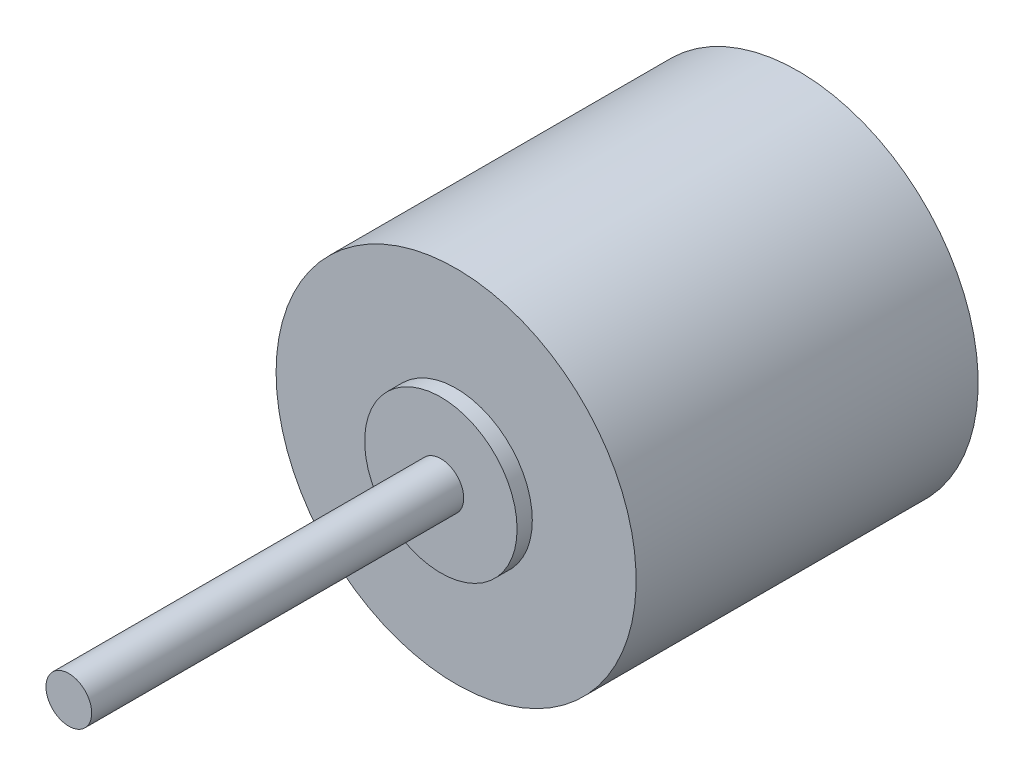
ISO-10303-21;
HEADER;
FILE_DESCRIPTION(('STEP AP214'),'2;1');
FILE_NAME('part.step','',(''),(''),'','','');
FILE_SCHEMA(('AUTOMOTIVE_DESIGN { 1 0 10303 214 1 1 1 1 }'));
ENDSEC;
DATA;
#1=APPLICATION_CONTEXT('core data for automotive mechanical design processes');
#2=APPLICATION_PROTOCOL_DEFINITION('international standard','automotive_design',2000,#1);
#3=PRODUCT_CONTEXT('',#1,'mechanical');
#4=PRODUCT('Part','Part','',(#3));
#5=PRODUCT_RELATED_PRODUCT_CATEGORY('part','',(#4));
#6=PRODUCT_DEFINITION_FORMATION('','',#4);
#7=PRODUCT_DEFINITION_CONTEXT('part definition',#1,'design');
#8=PRODUCT_DEFINITION('design','',#6,#7);
#9=PRODUCT_DEFINITION_SHAPE('','',#8);
#10=(LENGTH_UNIT() NAMED_UNIT(*) SI_UNIT(.MILLI.,.METRE.));
#11=(NAMED_UNIT(*) PLANE_ANGLE_UNIT() SI_UNIT($,.RADIAN.));
#12=(NAMED_UNIT(*) SI_UNIT($,.STERADIAN.) SOLID_ANGLE_UNIT());
#13=UNCERTAINTY_MEASURE_WITH_UNIT(LENGTH_MEASURE(1.E-05),#10,'distance_accuracy_value','');
#14=(GEOMETRIC_REPRESENTATION_CONTEXT(3) GLOBAL_UNCERTAINTY_ASSIGNED_CONTEXT((#13)) GLOBAL_UNIT_ASSIGNED_CONTEXT((#10,
#11,#12)) REPRESENTATION_CONTEXT('',''));
#15=CARTESIAN_POINT('',(0.,0.,0.));
#16=DIRECTION('',(0.,0.,1.));
#17=DIRECTION('',(1.,0.,0.));
#18=AXIS2_PLACEMENT_3D('',#15,#16,#17);
#19=CARTESIAN_POINT('',(0.,0.,57.));
#20=DIRECTION('',(0.,0.,-1.));
#21=DIRECTION('',(-1.,0.,0.));
#22=AXIS2_PLACEMENT_3D('',#19,#20,#21);
#23=CYLINDRICAL_SURFACE('',#22,30.);
#24=CARTESIAN_POINT('',(0.,0.,57.));
#25=DIRECTION('',(0.,0.,1.));
#26=DIRECTION('',(1.,0.,0.));
#27=AXIS2_PLACEMENT_3D('',#24,#25,#26);
#28=CIRCLE('',#27,30.);
#29=CARTESIAN_POINT('',(-30.,0.,57.));
#30=VERTEX_POINT('',#29);
#31=EDGE_CURVE('E53',#30,#30,#28,.T.);
#32=CARTESIAN_POINT('',(0.,0.,0.));
#33=DIRECTION('',(0.,0.,1.));
#34=DIRECTION('',(1.,0.,0.));
#35=AXIS2_PLACEMENT_3D('',#32,#33,#34);
#36=CIRCLE('',#35,30.);
#37=CARTESIAN_POINT('',(-30.,0.,0.));
#38=VERTEX_POINT('',#37);
#39=EDGE_CURVE('E42',#38,#38,#36,.T.);
#40=CARTESIAN_POINT('',(-30.,0.,57.));
#41=CARTESIAN_POINT('',(-30.,0.,56.40625));
#42=CARTESIAN_POINT('',(-30.,0.,55.8125));
#43=CARTESIAN_POINT('',(-30.,0.,54.625));
#44=CARTESIAN_POINT('',(-30.,0.,54.03125));
#45=CARTESIAN_POINT('',(-30.,0.,52.84375));
#46=CARTESIAN_POINT('',(-30.,0.,52.25));
#47=CARTESIAN_POINT('',(-30.,0.,51.0625));
#48=CARTESIAN_POINT('',(-30.,0.,50.46875));
#49=CARTESIAN_POINT('',(-30.,0.,49.28125));
#50=CARTESIAN_POINT('',(-30.,0.,48.6875));
#51=CARTESIAN_POINT('',(-30.,0.,47.5));
#52=CARTESIAN_POINT('',(-30.,0.,46.90625));
#53=CARTESIAN_POINT('',(-30.,0.,45.71875));
#54=CARTESIAN_POINT('',(-30.,0.,45.125));
#55=CARTESIAN_POINT('',(-30.,0.,43.9375));
#56=CARTESIAN_POINT('',(-30.,0.,43.34375));
#57=CARTESIAN_POINT('',(-30.,0.,42.15625));
#58=CARTESIAN_POINT('',(-30.,0.,41.5625));
#59=CARTESIAN_POINT('',(-30.,0.,40.375));
#60=CARTESIAN_POINT('',(-30.,0.,39.78125));
#61=CARTESIAN_POINT('',(-30.,0.,38.59375));
#62=CARTESIAN_POINT('',(-30.,0.,38.));
#63=CARTESIAN_POINT('',(-30.,0.,36.8125));
#64=CARTESIAN_POINT('',(-30.,0.,36.21875));
#65=CARTESIAN_POINT('',(-30.,0.,35.03125));
#66=CARTESIAN_POINT('',(-30.,0.,34.4375));
#67=CARTESIAN_POINT('',(-30.,0.,33.25));
#68=CARTESIAN_POINT('',(-30.,0.,32.65625));
#69=CARTESIAN_POINT('',(-30.,0.,31.46875));
#70=CARTESIAN_POINT('',(-30.,0.,30.875));
#71=CARTESIAN_POINT('',(-30.,0.,29.6875));
#72=CARTESIAN_POINT('',(-30.,0.,29.09375));
#73=CARTESIAN_POINT('',(-30.,0.,27.90625));
#74=CARTESIAN_POINT('',(-30.,0.,27.3125));
#75=CARTESIAN_POINT('',(-30.,0.,26.125));
#76=CARTESIAN_POINT('',(-30.,0.,25.53125));
#77=CARTESIAN_POINT('',(-30.,0.,24.34375));
#78=CARTESIAN_POINT('',(-30.,0.,23.75));
#79=CARTESIAN_POINT('',(-30.,0.,22.5625));
#80=CARTESIAN_POINT('',(-30.,0.,21.96875));
#81=CARTESIAN_POINT('',(-30.,0.,20.78125));
#82=CARTESIAN_POINT('',(-30.,0.,20.1875));
#83=CARTESIAN_POINT('',(-30.,0.,19.));
#84=CARTESIAN_POINT('',(-30.,0.,18.40625));
#85=CARTESIAN_POINT('',(-30.,0.,17.21875));
#86=CARTESIAN_POINT('',(-30.,0.,16.625));
#87=CARTESIAN_POINT('',(-30.,0.,15.4375));
#88=CARTESIAN_POINT('',(-30.,0.,14.84375));
#89=CARTESIAN_POINT('',(-30.,0.,13.65625));
#90=CARTESIAN_POINT('',(-30.,0.,13.0625));
#91=CARTESIAN_POINT('',(-30.,0.,11.875));
#92=CARTESIAN_POINT('',(-30.,0.,11.28125));
#93=CARTESIAN_POINT('',(-30.,0.,10.09375));
#94=CARTESIAN_POINT('',(-30.,0.,9.5));
#95=CARTESIAN_POINT('',(-30.,0.,8.3125));
#96=CARTESIAN_POINT('',(-30.,0.,7.71875));
#97=CARTESIAN_POINT('',(-30.,0.,6.53125));
#98=CARTESIAN_POINT('',(-30.,0.,5.9375));
#99=CARTESIAN_POINT('',(-30.,0.,4.75));
#100=CARTESIAN_POINT('',(-30.,0.,4.15625));
#101=CARTESIAN_POINT('',(-30.,0.,2.96875));
#102=CARTESIAN_POINT('',(-30.,0.,2.375));
#103=CARTESIAN_POINT('',(-30.,0.,1.1875));
#104=CARTESIAN_POINT('',(-30.,0.,0.593749999999999));
#105=CARTESIAN_POINT('',(-30.,0.,0.));
#106=B_SPLINE_CURVE_WITH_KNOTS('',3,(#40,#41,#42,#43,#44,#45,#46,#47,#48,#49,#50,#51,#52,#53,
#54,#55,#56,#57,#58,#59,#60,#61,#62,#63,#64,#65,#66,#67,#68,#69,#70,#71,#72,#73,#74,#75,#76,#77,
#78,#79,#80,#81,#82,#83,#84,#85,#86,#87,#88,#89,#90,#91,#92,#93,#94,#95,#96,#97,#98,#99,#100,
#101,#102,#103,#104,#105),.UNSPECIFIED.,.F.,.F.,(4,2,2,2,2,2,2,2,2,2,2,2,2,2,2,2,2,2,2,2,2,2,2,
2,2,2,2,2,2,2,2,2,4),(0.,1.78125,3.5625,5.34374999999999,7.12499999999999,8.90625,10.6875,
12.46875,14.25,16.03125,17.8125,19.59375,21.375,23.15625,24.9375,26.71875,28.5,30.28125,32.0625,
33.84375,35.625,37.40625,39.1875,40.96875,42.75,44.53125,46.3125,48.09375,49.875,51.65625,
53.4375,55.21875,57.),.UNSPECIFIED.);
#107=EDGE_CURVE('BSEAM39',#30,#38,#106,.T.);
#108=ORIENTED_EDGE('',*,*,#31,.F.);
#109=ORIENTED_EDGE('',*,*,#39,.T.);
#110=ORIENTED_EDGE('',*,*,#107,.T.);
#111=ORIENTED_EDGE('',*,*,#107,.F.);
#112=EDGE_LOOP('',(#108,#110,#109,#111));
#113=FACE_BOUND('',#112,.T.);
#114=ADVANCED_FACE('F39',(#113),#23,.T.);
#115=CARTESIAN_POINT('',(0.,0.,57.));
#116=DIRECTION('',(0.,0.,1.));
#117=DIRECTION('',(1.,0.,0.));
#118=AXIS2_PLACEMENT_3D('',#115,#116,#117);
#119=PLANE('',#118);
#120=CARTESIAN_POINT('',(0.,0.,57.));
#121=DIRECTION('',(0.,0.,1.));
#122=DIRECTION('',(1.,0.,0.));
#123=AXIS2_PLACEMENT_3D('',#120,#121,#122);
#124=CIRCLE('',#123,12.7);
#125=CARTESIAN_POINT('',(12.7,0.,57.));
#126=VERTEX_POINT('',#125);
#127=EDGE_CURVE('E47',#126,#126,#124,.T.);
#128=ORIENTED_EDGE('',*,*,#127,.F.);
#129=EDGE_LOOP('',(#128));
#130=FACE_BOUND('',#129,.T.);
#131=ORIENTED_EDGE('',*,*,#31,.T.);
#132=EDGE_LOOP('',(#131));
#133=FACE_BOUND('',#132,.T.);
#134=ADVANCED_FACE('F74',(#130,#133),#119,.T.);
#135=CARTESIAN_POINT('',(0.,0.,0.));
#136=DIRECTION('',(0.,0.,1.));
#137=DIRECTION('',(1.,0.,0.));
#138=AXIS2_PLACEMENT_3D('',#135,#136,#137);
#139=PLANE('',#138);
#140=CARTESIAN_POINT('',(-16.,0.,0.));
#141=DIRECTION('',(0.,0.,-1.));
#142=DIRECTION('',(-1.,0.,0.));
#143=AXIS2_PLACEMENT_3D('',#140,#141,#142);
#144=CIRCLE('',#143,2.);
#145=CARTESIAN_POINT('',(-18.,0.,0.));
#146=VERTEX_POINT('',#145);
#147=EDGE_CURVE('E222',#146,#146,#144,.T.);
#148=ORIENTED_EDGE('',*,*,#147,.F.);
#149=EDGE_LOOP('',(#148));
#150=FACE_BOUND('',#149,.T.);
#151=CARTESIAN_POINT('',(0.,16.,0.));
#152=DIRECTION('',(0.,0.,-1.));
#153=DIRECTION('',(-1.,0.,0.));
#154=AXIS2_PLACEMENT_3D('',#151,#152,#153);
#155=CIRCLE('',#154,2.);
#156=CARTESIAN_POINT('',(-2.,16.,0.));
#157=VERTEX_POINT('',#156);
#158=EDGE_CURVE('E228',#157,#157,#155,.T.);
#159=ORIENTED_EDGE('',*,*,#158,.F.);
#160=EDGE_LOOP('',(#159));
#161=FACE_BOUND('',#160,.T.);
#162=CARTESIAN_POINT('',(16.,0.,0.));
#163=DIRECTION('',(0.,0.,-1.));
#164=DIRECTION('',(-1.,0.,0.));
#165=AXIS2_PLACEMENT_3D('',#162,#163,#164);
#166=CIRCLE('',#165,2.);
#167=CARTESIAN_POINT('',(14.,0.,0.));
#168=VERTEX_POINT('',#167);
#169=EDGE_CURVE('E238',#168,#168,#166,.T.);
#170=ORIENTED_EDGE('',*,*,#169,.F.);
#171=EDGE_LOOP('',(#170));
#172=FACE_BOUND('',#171,.T.);
#173=CARTESIAN_POINT('',(0.,-16.,0.));
#174=DIRECTION('',(0.,0.,-1.));
#175=DIRECTION('',(-1.,0.,0.));
#176=AXIS2_PLACEMENT_3D('',#173,#174,#175);
#177=CIRCLE('',#176,2.);
#178=CARTESIAN_POINT('',(-2.,-16.,0.));
#179=VERTEX_POINT('',#178);
#180=EDGE_CURVE('E246',#179,#179,#177,.T.);
#181=ORIENTED_EDGE('',*,*,#180,.F.);
#182=EDGE_LOOP('',(#181));
#183=FACE_BOUND('',#182,.T.);
#184=ORIENTED_EDGE('',*,*,#39,.F.);
#185=EDGE_LOOP('',(#184));
#186=FACE_BOUND('',#185,.T.);
#187=ADVANCED_FACE('F71',(#150,#161,#172,#183,#186),#139,.F.);
#188=CARTESIAN_POINT('',(0.,0.,59.54));
#189=DIRECTION('',(0.,0.,-1.));
#190=DIRECTION('',(-1.,0.,0.));
#191=AXIS2_PLACEMENT_3D('',#188,#189,#190);
#192=CYLINDRICAL_SURFACE('',#191,12.7);
#193=CARTESIAN_POINT('',(0.,0.,59.54));
#194=DIRECTION('',(0.,0.,1.));
#195=DIRECTION('',(1.,0.,0.));
#196=AXIS2_PLACEMENT_3D('',#193,#194,#195);
#197=CIRCLE('',#196,12.7);
#198=CARTESIAN_POINT('',(12.7,0.,59.54));
#199=VERTEX_POINT('',#198);
#200=EDGE_CURVE('E59',#199,#199,#197,.T.);
#201=ORIENTED_EDGE('',*,*,#200,.F.);
#202=EDGE_LOOP('',(#201));
#203=FACE_BOUND('',#202,.T.);
#204=ORIENTED_EDGE('',*,*,#127,.T.);
#205=EDGE_LOOP('',(#204));
#206=FACE_BOUND('',#205,.T.);
#207=ADVANCED_FACE('F73',(#203,#206),#192,.T.);
#208=CARTESIAN_POINT('',(0.,0.,59.54));
#209=DIRECTION('',(0.,0.,1.));
#210=DIRECTION('',(1.,0.,0.));
#211=AXIS2_PLACEMENT_3D('',#208,#209,#210);
#212=PLANE('',#211);
#213=CARTESIAN_POINT('',(0.,0.,59.54));
#214=DIRECTION('',(0.,0.,1.));
#215=DIRECTION('',(1.,0.,0.));
#216=AXIS2_PLACEMENT_3D('',#213,#214,#215);
#217=CIRCLE('',#216,3.81);
#218=CARTESIAN_POINT('',(3.81,0.,59.54));
#219=VERTEX_POINT('',#218);
#220=EDGE_CURVE('E10',#219,#219,#217,.T.);
#221=ORIENTED_EDGE('',*,*,#220,.F.);
#222=EDGE_LOOP('',(#221));
#223=FACE_BOUND('',#222,.T.);
#224=ORIENTED_EDGE('',*,*,#200,.T.);
#225=EDGE_LOOP('',(#224));
#226=FACE_BOUND('',#225,.T.);
#227=ADVANCED_FACE('F80',(#223,#226),#212,.T.);
#228=CARTESIAN_POINT('',(0.,0.,121.54));
#229=DIRECTION('',(0.,0.,-1.));
#230=DIRECTION('',(-1.,0.,0.));
#231=AXIS2_PLACEMENT_3D('',#228,#229,#230);
#232=CYLINDRICAL_SURFACE('',#231,3.81);
#233=CARTESIAN_POINT('',(0.,0.,121.54));
#234=DIRECTION('',(0.,0.,1.));
#235=DIRECTION('',(1.,0.,0.));
#236=AXIS2_PLACEMENT_3D('',#233,#234,#235);
#237=CIRCLE('',#236,3.81);
#238=CARTESIAN_POINT('',(3.81,0.,121.54));
#239=VERTEX_POINT('',#238);
#240=EDGE_CURVE('E57',#239,#239,#237,.T.);
#241=ORIENTED_EDGE('',*,*,#240,.F.);
#242=EDGE_LOOP('',(#241));
#243=FACE_BOUND('',#242,.T.);
#244=ORIENTED_EDGE('',*,*,#220,.T.);
#245=EDGE_LOOP('',(#244));
#246=FACE_BOUND('',#245,.T.);
#247=ADVANCED_FACE('F111',(#243,#246),#232,.T.);
#248=CARTESIAN_POINT('',(0.,0.,121.54));
#249=DIRECTION('',(0.,0.,1.));
#250=DIRECTION('',(1.,0.,0.));
#251=AXIS2_PLACEMENT_3D('',#248,#249,#250);
#252=PLANE('',#251);
#253=ORIENTED_EDGE('',*,*,#240,.T.);
#254=EDGE_LOOP('',(#253));
#255=FACE_BOUND('',#254,.T.);
#256=ADVANCED_FACE('F121',(#255),#252,.T.);
#257=CARTESIAN_POINT('',(0.,-16.,5.08));
#258=DIRECTION('',(0.,0.,-1.));
#259=DIRECTION('',(-1.,0.,0.));
#260=AXIS2_PLACEMENT_3D('',#257,#258,#259);
#261=CYLINDRICAL_SURFACE('',#260,2.);
#262=CARTESIAN_POINT('',(0.,-16.,5.08));
#263=DIRECTION('',(0.,0.,-1.));
#264=DIRECTION('',(-1.,0.,0.));
#265=AXIS2_PLACEMENT_3D('',#262,#263,#264);
#266=CIRCLE('',#265,2.);
#267=CARTESIAN_POINT('',(-2.,-16.,5.08));
#268=VERTEX_POINT('',#267);
#269=EDGE_CURVE('E249',#268,#268,#266,.T.);
#270=ORIENTED_EDGE('',*,*,#269,.F.);
#271=EDGE_LOOP('',(#270));
#272=FACE_BOUND('',#271,.T.);
#273=ORIENTED_EDGE('',*,*,#180,.T.);
#274=EDGE_LOOP('',(#273));
#275=FACE_BOUND('',#274,.T.);
#276=ADVANCED_FACE('F130',(#272,#275),#261,.F.);
#277=CARTESIAN_POINT('',(0.,-16.,5.08));
#278=DIRECTION('',(0.,0.,-1.));
#279=DIRECTION('',(-1.,0.,0.));
#280=AXIS2_PLACEMENT_3D('',#277,#278,#279);
#281=PLANE('',#280);
#282=ORIENTED_EDGE('',*,*,#269,.T.);
#283=EDGE_LOOP('',(#282));
#284=FACE_BOUND('',#283,.T.);
#285=ADVANCED_FACE('F144',(#284),#281,.T.);
#286=CARTESIAN_POINT('',(16.,0.,5.08));
#287=DIRECTION('',(0.,0.,-1.));
#288=DIRECTION('',(-1.,0.,0.));
#289=AXIS2_PLACEMENT_3D('',#286,#287,#288);
#290=CYLINDRICAL_SURFACE('',#289,2.);
#291=CARTESIAN_POINT('',(16.,0.,5.08));
#292=DIRECTION('',(0.,0.,-1.));
#293=DIRECTION('',(-1.,0.,0.));
#294=AXIS2_PLACEMENT_3D('',#291,#292,#293);
#295=CIRCLE('',#294,2.);
#296=CARTESIAN_POINT('',(14.,0.,5.08));
#297=VERTEX_POINT('',#296);
#298=EDGE_CURVE('E242',#297,#297,#295,.T.);
#299=ORIENTED_EDGE('',*,*,#298,.F.);
#300=EDGE_LOOP('',(#299));
#301=FACE_BOUND('',#300,.T.);
#302=ORIENTED_EDGE('',*,*,#169,.T.);
#303=EDGE_LOOP('',(#302));
#304=FACE_BOUND('',#303,.T.);
#305=ADVANCED_FACE('F154',(#301,#304),#290,.F.);
#306=CARTESIAN_POINT('',(16.,0.,5.08));
#307=DIRECTION('',(0.,0.,-1.));
#308=DIRECTION('',(-1.,0.,0.));
#309=AXIS2_PLACEMENT_3D('',#306,#307,#308);
#310=PLANE('',#309);
#311=ORIENTED_EDGE('',*,*,#298,.T.);
#312=EDGE_LOOP('',(#311));
#313=FACE_BOUND('',#312,.T.);
#314=ADVANCED_FACE('F164',(#313),#310,.T.);
#315=CARTESIAN_POINT('',(0.,16.,5.08));
#316=DIRECTION('',(0.,0.,-1.));
#317=DIRECTION('',(-1.,0.,0.));
#318=AXIS2_PLACEMENT_3D('',#315,#316,#317);
#319=CYLINDRICAL_SURFACE('',#318,2.);
#320=CARTESIAN_POINT('',(0.,16.,5.08));
#321=DIRECTION('',(0.,0.,-1.));
#322=DIRECTION('',(-1.,0.,0.));
#323=AXIS2_PLACEMENT_3D('',#320,#321,#322);
#324=CIRCLE('',#323,2.);
#325=CARTESIAN_POINT('',(-2.,16.,5.08));
#326=VERTEX_POINT('',#325);
#327=EDGE_CURVE('E234',#326,#326,#324,.T.);
#328=ORIENTED_EDGE('',*,*,#327,.F.);
#329=EDGE_LOOP('',(#328));
#330=FACE_BOUND('',#329,.T.);
#331=ORIENTED_EDGE('',*,*,#158,.T.);
#332=EDGE_LOOP('',(#331));
#333=FACE_BOUND('',#332,.T.);
#334=ADVANCED_FACE('F174',(#330,#333),#319,.F.);
#335=CARTESIAN_POINT('',(0.,16.,5.08));
#336=DIRECTION('',(0.,0.,-1.));
#337=DIRECTION('',(-1.,0.,0.));
#338=AXIS2_PLACEMENT_3D('',#335,#336,#337);
#339=PLANE('',#338);
#340=ORIENTED_EDGE('',*,*,#327,.T.);
#341=EDGE_LOOP('',(#340));
#342=FACE_BOUND('',#341,.T.);
#343=ADVANCED_FACE('F184',(#342),#339,.T.);
#344=CARTESIAN_POINT('',(-16.,0.,5.08));
#345=DIRECTION('',(0.,0.,-1.));
#346=DIRECTION('',(-1.,0.,0.));
#347=AXIS2_PLACEMENT_3D('',#344,#345,#346);
#348=CYLINDRICAL_SURFACE('',#347,2.);
#349=CARTESIAN_POINT('',(-16.,0.,5.08));
#350=DIRECTION('',(0.,0.,-1.));
#351=DIRECTION('',(-1.,0.,0.));
#352=AXIS2_PLACEMENT_3D('',#349,#350,#351);
#353=CIRCLE('',#352,2.);
#354=CARTESIAN_POINT('',(-18.,0.,5.08));
#355=VERTEX_POINT('',#354);
#356=EDGE_CURVE('E220',#355,#355,#353,.T.);
#357=ORIENTED_EDGE('',*,*,#356,.F.);
#358=EDGE_LOOP('',(#357));
#359=FACE_BOUND('',#358,.T.);
#360=ORIENTED_EDGE('',*,*,#147,.T.);
#361=EDGE_LOOP('',(#360));
#362=FACE_BOUND('',#361,.T.);
#363=ADVANCED_FACE('F194',(#359,#362),#348,.F.);
#364=CARTESIAN_POINT('',(-16.,0.,5.08));
#365=DIRECTION('',(0.,0.,-1.));
#366=DIRECTION('',(-1.,0.,0.));
#367=AXIS2_PLACEMENT_3D('',#364,#365,#366);
#368=PLANE('',#367);
#369=ORIENTED_EDGE('',*,*,#356,.T.);
#370=EDGE_LOOP('',(#369));
#371=FACE_BOUND('',#370,.T.);
#372=ADVANCED_FACE('F204',(#371),#368,.T.);
#373=CLOSED_SHELL('',(#114,#134,#187,#207,#227,#247,#256,#276,#285,#305,#314,#334,#343,#363,#372));
#374=MANIFOLD_SOLID_BREP('B2',#373);
#375=ADVANCED_BREP_SHAPE_REPRESENTATION('',(#18,#374),#14);
#376=SHAPE_DEFINITION_REPRESENTATION(#9,#375);
ENDSEC;
END-ISO-10303-21;
